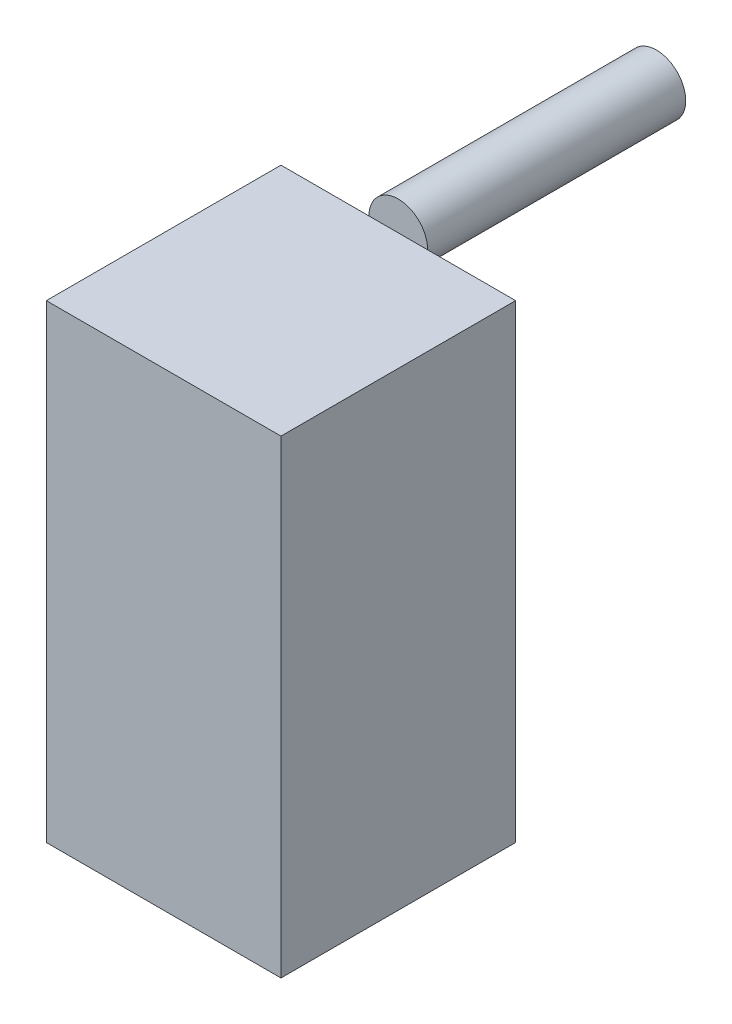
ISO-10303-21;
HEADER;
FILE_DESCRIPTION(('STEP AP214'),'2;1');
FILE_NAME('part.step','',(''),(''),'','','');
FILE_SCHEMA(('AUTOMOTIVE_DESIGN { 1 0 10303 214 1 1 1 1 }'));
ENDSEC;
DATA;
#1=APPLICATION_CONTEXT('core data for automotive mechanical design processes');
#2=APPLICATION_PROTOCOL_DEFINITION('international standard','automotive_design',2000,#1);
#3=PRODUCT_CONTEXT('',#1,'mechanical');
#4=PRODUCT('Part','Part','',(#3));
#5=PRODUCT_RELATED_PRODUCT_CATEGORY('part','',(#4));
#6=PRODUCT_DEFINITION_FORMATION('','',#4);
#7=PRODUCT_DEFINITION_CONTEXT('part definition',#1,'design');
#8=PRODUCT_DEFINITION('design','',#6,#7);
#9=PRODUCT_DEFINITION_SHAPE('','',#8);
#10=(LENGTH_UNIT() NAMED_UNIT(*) SI_UNIT(.MILLI.,.METRE.));
#11=(NAMED_UNIT(*) PLANE_ANGLE_UNIT() SI_UNIT($,.RADIAN.));
#12=(NAMED_UNIT(*) SI_UNIT($,.STERADIAN.) SOLID_ANGLE_UNIT());
#13=UNCERTAINTY_MEASURE_WITH_UNIT(LENGTH_MEASURE(1.E-05),#10,'distance_accuracy_value','');
#14=(GEOMETRIC_REPRESENTATION_CONTEXT(3) GLOBAL_UNCERTAINTY_ASSIGNED_CONTEXT((#13)) GLOBAL_UNIT_ASSIGNED_CONTEXT((#10,
#11,#12)) REPRESENTATION_CONTEXT('',''));
#15=CARTESIAN_POINT('',(0.,0.,0.));
#16=DIRECTION('',(0.,0.,1.));
#17=DIRECTION('',(1.,0.,0.));
#18=AXIS2_PLACEMENT_3D('',#15,#16,#17);
#19=CARTESIAN_POINT('',(10.,40.,-10.));
#20=DIRECTION('',(-1.,0.,0.));
#21=DIRECTION('',(0.,0.,1.));
#22=AXIS2_PLACEMENT_3D('',#19,#20,#21);
#23=PLANE('',#22);
#24=DIRECTION('',(0.,0.,-1.));
#25=VECTOR('',#24,1.);
#26=CARTESIAN_POINT('',(10.,0.,-10.));
#27=LINE('',#26,#25);
#28=CARTESIAN_POINT('',(10.,0.,10.));
#29=VERTEX_POINT('',#28);
#30=CARTESIAN_POINT('',(10.,0.,-10.));
#31=VERTEX_POINT('',#30);
#32=EDGE_CURVE('E115',#29,#31,#27,.T.);
#33=ORIENTED_EDGE('',*,*,#32,.T.);
#34=DIRECTION('',(0.,-1.,0.));
#35=VECTOR('',#34,1.);
#36=CARTESIAN_POINT('',(10.,40.,-10.));
#37=LINE('',#36,#35);
#38=CARTESIAN_POINT('',(10.,40.,-10.));
#39=VERTEX_POINT('',#38);
#40=EDGE_CURVE('E42',#39,#31,#37,.T.);
#41=ORIENTED_EDGE('',*,*,#40,.F.);
#42=DIRECTION('',(0.,0.,-1.));
#43=VECTOR('',#42,1.);
#44=CARTESIAN_POINT('',(10.,40.,-10.));
#45=LINE('',#44,#43);
#46=CARTESIAN_POINT('',(10.,40.,10.));
#47=VERTEX_POINT('',#46);
#48=EDGE_CURVE('E107',#47,#39,#45,.T.);
#49=ORIENTED_EDGE('',*,*,#48,.F.);
#50=DIRECTION('',(0.,-1.,0.));
#51=VECTOR('',#50,1.);
#52=CARTESIAN_POINT('',(10.,40.,10.));
#53=LINE('',#52,#51);
#54=EDGE_CURVE('E126',#47,#29,#53,.T.);
#55=ORIENTED_EDGE('',*,*,#54,.T.);
#56=EDGE_LOOP('',(#33,#41,#49,#55));
#57=FACE_BOUND('',#56,.T.);
#58=ADVANCED_FACE('F39',(#57),#23,.F.);
#59=CARTESIAN_POINT('',(-10.,40.,-10.));
#60=DIRECTION('',(0.,0.,1.));
#61=DIRECTION('',(1.,0.,0.));
#62=AXIS2_PLACEMENT_3D('',#59,#60,#61);
#63=PLANE('',#62);
#64=CARTESIAN_POINT('',(0.,40.,-10.));
#65=DIRECTION('',(0.,0.,-1.));
#66=DIRECTION('',(-1.,0.,0.));
#67=AXIS2_PLACEMENT_3D('',#64,#65,#66);
#68=CIRCLE('',#67,2.5);
#69=CARTESIAN_POINT('',(2.5,40.,-10.));
#70=VERTEX_POINT('',#69);
#71=CARTESIAN_POINT('',(-2.5,40.,-10.));
#72=VERTEX_POINT('',#71);
#73=EDGE_CURVE('E11',#70,#72,#68,.T.);
#74=ORIENTED_EDGE('',*,*,#73,.F.);
#75=DIRECTION('',(-1.,0.,0.));
#76=VECTOR('',#75,1.);
#77=CARTESIAN_POINT('',(-10.,40.,-10.));
#78=LINE('',#77,#76);
#79=EDGE_CURVE('E88',#39,#70,#78,.T.);
#80=ORIENTED_EDGE('',*,*,#79,.F.);
#81=ORIENTED_EDGE('',*,*,#40,.T.);
#82=DIRECTION('',(-1.,0.,0.));
#83=VECTOR('',#82,1.);
#84=CARTESIAN_POINT('',(-10.,0.,-10.));
#85=LINE('',#84,#83);
#86=CARTESIAN_POINT('',(-10.,0.,-10.));
#87=VERTEX_POINT('',#86);
#88=EDGE_CURVE('E130',#31,#87,#85,.T.);
#89=ORIENTED_EDGE('',*,*,#88,.T.);
#90=DIRECTION('',(0.,-1.,0.));
#91=VECTOR('',#90,1.);
#92=CARTESIAN_POINT('',(-10.,40.,-10.));
#93=LINE('',#92,#91);
#94=CARTESIAN_POINT('',(-10.,40.,-10.));
#95=VERTEX_POINT('',#94);
#96=EDGE_CURVE('E104',#95,#87,#93,.T.);
#97=ORIENTED_EDGE('',*,*,#96,.F.);
#98=EDGE_CURVE('E95',#72,#95,#78,.T.);
#99=ORIENTED_EDGE('',*,*,#98,.F.);
#100=EDGE_LOOP('',(#74,#80,#81,#89,#97,#99));
#101=FACE_BOUND('',#100,.T.);
#102=ADVANCED_FACE('F102',(#101),#63,.F.);
#103=CARTESIAN_POINT('',(-10.,40.,-10.));
#104=DIRECTION('',(1.,0.,0.));
#105=DIRECTION('',(0.,0.,-1.));
#106=AXIS2_PLACEMENT_3D('',#103,#104,#105);
#107=PLANE('',#106);
#108=DIRECTION('',(0.,0.,1.));
#109=VECTOR('',#108,1.);
#110=CARTESIAN_POINT('',(-10.,0.,-10.));
#111=LINE('',#110,#109);
#112=CARTESIAN_POINT('',(-10.,0.,10.));
#113=VERTEX_POINT('',#112);
#114=EDGE_CURVE('E133',#87,#113,#111,.T.);
#115=ORIENTED_EDGE('',*,*,#114,.T.);
#116=DIRECTION('',(0.,-1.,0.));
#117=VECTOR('',#116,1.);
#118=CARTESIAN_POINT('',(-10.,40.,10.));
#119=LINE('',#118,#117);
#120=CARTESIAN_POINT('',(-10.,40.,10.));
#121=VERTEX_POINT('',#120);
#122=EDGE_CURVE('E140',#121,#113,#119,.T.);
#123=ORIENTED_EDGE('',*,*,#122,.F.);
#124=DIRECTION('',(0.,0.,1.));
#125=VECTOR('',#124,1.);
#126=CARTESIAN_POINT('',(-10.,40.,-10.));
#127=LINE('',#126,#125);
#128=EDGE_CURVE('E121',#95,#121,#127,.T.);
#129=ORIENTED_EDGE('',*,*,#128,.F.);
#130=ORIENTED_EDGE('',*,*,#96,.T.);
#131=EDGE_LOOP('',(#115,#123,#129,#130));
#132=FACE_BOUND('',#131,.T.);
#133=ADVANCED_FACE('F153',(#132),#107,.F.);
#134=CARTESIAN_POINT('',(-10.,40.,10.));
#135=DIRECTION('',(0.,0.,-1.));
#136=DIRECTION('',(-1.,0.,0.));
#137=AXIS2_PLACEMENT_3D('',#134,#135,#136);
#138=PLANE('',#137);
#139=DIRECTION('',(1.,0.,0.));
#140=VECTOR('',#139,1.);
#141=CARTESIAN_POINT('',(-10.,0.,10.));
#142=LINE('',#141,#140);
#143=EDGE_CURVE('E84',#113,#29,#142,.T.);
#144=ORIENTED_EDGE('',*,*,#143,.T.);
#145=ORIENTED_EDGE('',*,*,#54,.F.);
#146=DIRECTION('',(1.,0.,0.));
#147=VECTOR('',#146,1.);
#148=CARTESIAN_POINT('',(-10.,40.,10.));
#149=LINE('',#148,#147);
#150=EDGE_CURVE('E63',#121,#47,#149,.T.);
#151=ORIENTED_EDGE('',*,*,#150,.F.);
#152=ORIENTED_EDGE('',*,*,#122,.T.);
#153=EDGE_LOOP('',(#144,#145,#151,#152));
#154=FACE_BOUND('',#153,.T.);
#155=ADVANCED_FACE('F154',(#154),#138,.F.);
#156=CARTESIAN_POINT('',(0.,40.,0.));
#157=DIRECTION('',(0.,1.,0.));
#158=DIRECTION('',(0.,0.,1.));
#159=AXIS2_PLACEMENT_3D('',#156,#157,#158);
#160=PLANE('',#159);
#161=ORIENTED_EDGE('',*,*,#48,.T.);
#162=ORIENTED_EDGE('',*,*,#79,.T.);
#163=EDGE_CURVE('E93',#70,#72,#78,.T.);
#164=ORIENTED_EDGE('',*,*,#163,.T.);
#165=ORIENTED_EDGE('',*,*,#98,.T.);
#166=ORIENTED_EDGE('',*,*,#128,.T.);
#167=ORIENTED_EDGE('',*,*,#150,.T.);
#168=EDGE_LOOP('',(#161,#162,#164,#165,#166,#167));
#169=FACE_BOUND('',#168,.T.);
#170=ADVANCED_FACE('F94',(#169),#160,.T.);
#171=CARTESIAN_POINT('',(0.,0.,0.));
#172=DIRECTION('',(0.,1.,0.));
#173=DIRECTION('',(0.,0.,1.));
#174=AXIS2_PLACEMENT_3D('',#171,#172,#173);
#175=PLANE('',#174);
#176=ORIENTED_EDGE('',*,*,#32,.F.);
#177=ORIENTED_EDGE('',*,*,#143,.F.);
#178=ORIENTED_EDGE('',*,*,#114,.F.);
#179=ORIENTED_EDGE('',*,*,#88,.F.);
#180=EDGE_LOOP('',(#176,#177,#178,#179));
#181=FACE_BOUND('',#180,.T.);
#182=ADVANCED_FACE('F151',(#181),#175,.F.);
#183=CARTESIAN_POINT('',(0.,40.,-32.));
#184=DIRECTION('',(0.,0.,1.));
#185=DIRECTION('',(1.,0.,0.));
#186=AXIS2_PLACEMENT_3D('',#183,#184,#185);
#187=CYLINDRICAL_SURFACE('',#186,2.5);
#188=CARTESIAN_POINT('',(0.,40.,-32.));
#189=DIRECTION('',(0.,0.,-1.));
#190=DIRECTION('',(-1.,0.,0.));
#191=AXIS2_PLACEMENT_3D('',#188,#189,#190);
#192=CIRCLE('',#191,2.5);
#193=CARTESIAN_POINT('',(-2.5,40.,-32.));
#194=VERTEX_POINT('',#193);
#195=EDGE_CURVE('E112',#194,#194,#192,.T.);
#196=ORIENTED_EDGE('',*,*,#195,.F.);
#197=EDGE_LOOP('',(#196));
#198=FACE_BOUND('',#197,.T.);
#199=EDGE_CURVE('E49',#72,#70,#68,.T.);
#200=ORIENTED_EDGE('',*,*,#199,.T.);
#201=ORIENTED_EDGE('',*,*,#73,.T.);
#202=EDGE_LOOP('',(#200,#201));
#203=FACE_BOUND('',#202,.T.);
#204=ADVANCED_FACE('F109',(#198,#203),#187,.T.);
#205=CARTESIAN_POINT('',(0.,40.,-32.));
#206=DIRECTION('',(0.,0.,-1.));
#207=DIRECTION('',(-1.,0.,0.));
#208=AXIS2_PLACEMENT_3D('',#205,#206,#207);
#209=PLANE('',#208);
#210=ORIENTED_EDGE('',*,*,#195,.T.);
#211=EDGE_LOOP('',(#210));
#212=FACE_BOUND('',#211,.T.);
#213=ADVANCED_FACE('F199',(#212),#209,.T.);
#214=CARTESIAN_POINT('',(0.,40.,-10.));
#215=DIRECTION('',(0.,0.,-1.));
#216=DIRECTION('',(-1.,0.,0.));
#217=AXIS2_PLACEMENT_3D('',#214,#215,#216);
#218=PLANE('',#217);
#219=ORIENTED_EDGE('',*,*,#163,.F.);
#220=ORIENTED_EDGE('',*,*,#199,.F.);
#221=EDGE_LOOP('',(#219,#220));
#222=FACE_BOUND('',#221,.T.);
#223=ADVANCED_FACE('F110',(#222),#218,.F.);
#224=CLOSED_SHELL('',(#58,#102,#133,#155,#170,#182,#204,#213,#223));
#225=MANIFOLD_SOLID_BREP('B2',#224);
#226=ADVANCED_BREP_SHAPE_REPRESENTATION('',(#18,#225),#14);
#227=SHAPE_DEFINITION_REPRESENTATION(#9,#226);
ENDSEC;
END-ISO-10303-21;
